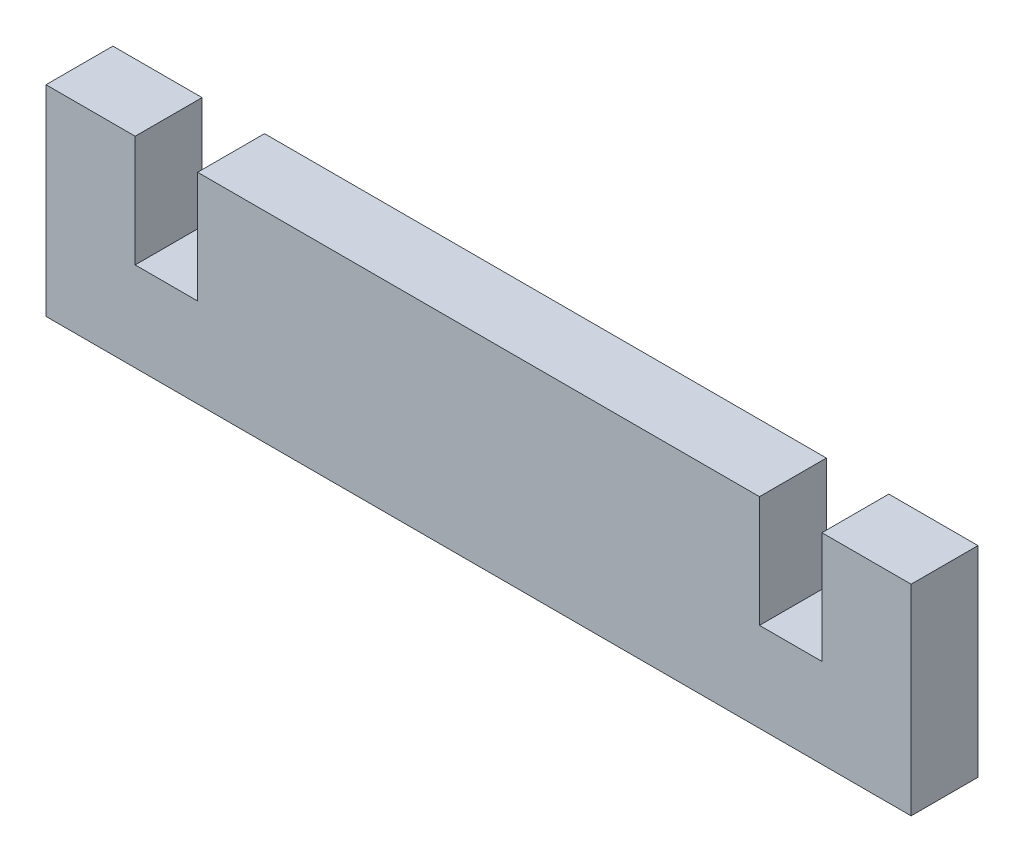
ISO-10303-21;
HEADER;
FILE_DESCRIPTION(('STEP AP214'),'2;1');
FILE_NAME('part.step','',(''),(''),'','','');
FILE_SCHEMA(('AUTOMOTIVE_DESIGN { 1 0 10303 214 1 1 1 1 }'));
ENDSEC;
DATA;
#1=APPLICATION_CONTEXT('core data for automotive mechanical design processes');
#2=APPLICATION_PROTOCOL_DEFINITION('international standard','automotive_design',2000,#1);
#3=PRODUCT_CONTEXT('',#1,'mechanical');
#4=PRODUCT('Part','Part','',(#3));
#5=PRODUCT_RELATED_PRODUCT_CATEGORY('part','',(#4));
#6=PRODUCT_DEFINITION_FORMATION('','',#4);
#7=PRODUCT_DEFINITION_CONTEXT('part definition',#1,'design');
#8=PRODUCT_DEFINITION('design','',#6,#7);
#9=PRODUCT_DEFINITION_SHAPE('','',#8);
#10=(LENGTH_UNIT() NAMED_UNIT(*) SI_UNIT(.MILLI.,.METRE.));
#11=(NAMED_UNIT(*) PLANE_ANGLE_UNIT() SI_UNIT($,.RADIAN.));
#12=(NAMED_UNIT(*) SI_UNIT($,.STERADIAN.) SOLID_ANGLE_UNIT());
#13=UNCERTAINTY_MEASURE_WITH_UNIT(LENGTH_MEASURE(1.E-05),#10,'distance_accuracy_value','');
#14=(GEOMETRIC_REPRESENTATION_CONTEXT(3) GLOBAL_UNCERTAINTY_ASSIGNED_CONTEXT((#13)) GLOBAL_UNIT_ASSIGNED_CONTEXT((#10,
#11,#12)) REPRESENTATION_CONTEXT('',''));
#15=CARTESIAN_POINT('',(0.,0.,0.));
#16=DIRECTION('',(0.,0.,1.));
#17=DIRECTION('',(1.,0.,0.));
#18=AXIS2_PLACEMENT_3D('',#15,#16,#17);
#19=CARTESIAN_POINT('',(77.6,0.,6.));
#20=DIRECTION('',(0.,1.,0.));
#21=DIRECTION('',(0.,0.,1.));
#22=AXIS2_PLACEMENT_3D('',#19,#20,#21);
#23=PLANE('',#22);
#24=DIRECTION('',(1.,0.,0.));
#25=VECTOR('',#24,1.);
#26=CARTESIAN_POINT('',(77.6,0.,0.));
#27=LINE('',#26,#25);
#28=CARTESIAN_POINT('',(0.,0.,0.));
#29=VERTEX_POINT('',#28);
#30=CARTESIAN_POINT('',(77.6,0.,0.));
#31=VERTEX_POINT('',#30);
#32=EDGE_CURVE('E274',#29,#31,#27,.T.);
#33=ORIENTED_EDGE('',*,*,#32,.T.);
#34=DIRECTION('',(0.,0.,-1.));
#35=VECTOR('',#34,1.);
#36=CARTESIAN_POINT('',(77.6,0.,6.));
#37=LINE('',#36,#35);
#38=CARTESIAN_POINT('',(77.6,0.,6.));
#39=VERTEX_POINT('',#38);
#40=EDGE_CURVE('E12',#39,#31,#37,.T.);
#41=ORIENTED_EDGE('',*,*,#40,.F.);
#42=DIRECTION('',(1.,0.,0.));
#43=VECTOR('',#42,1.);
#44=CARTESIAN_POINT('',(77.6,0.,6.));
#45=LINE('',#44,#43);
#46=CARTESIAN_POINT('',(0.,0.,6.));
#47=VERTEX_POINT('',#46);
#48=EDGE_CURVE('E211',#47,#39,#45,.T.);
#49=ORIENTED_EDGE('',*,*,#48,.F.);
#50=DIRECTION('',(0.,0.,-1.));
#51=VECTOR('',#50,1.);
#52=CARTESIAN_POINT('',(0.,0.,6.));
#53=LINE('',#52,#51);
#54=EDGE_CURVE('E169',#47,#29,#53,.T.);
#55=ORIENTED_EDGE('',*,*,#54,.T.);
#56=EDGE_LOOP('',(#33,#41,#49,#55));
#57=FACE_BOUND('',#56,.T.);
#58=ADVANCED_FACE('F46',(#57),#23,.F.);
#59=CARTESIAN_POINT('',(77.6,18.,6.));
#60=DIRECTION('',(-1.,0.,0.));
#61=DIRECTION('',(0.,0.,1.));
#62=AXIS2_PLACEMENT_3D('',#59,#60,#61);
#63=PLANE('',#62);
#64=DIRECTION('',(0.,1.,0.));
#65=VECTOR('',#64,1.);
#66=CARTESIAN_POINT('',(77.6,18.,0.));
#67=LINE('',#66,#65);
#68=CARTESIAN_POINT('',(77.6,18.,0.));
#69=VERTEX_POINT('',#68);
#70=EDGE_CURVE('E265',#31,#69,#67,.T.);
#71=ORIENTED_EDGE('',*,*,#70,.T.);
#72=DIRECTION('',(0.,0.,-1.));
#73=VECTOR('',#72,1.);
#74=CARTESIAN_POINT('',(77.6,18.,6.));
#75=LINE('',#74,#73);
#76=CARTESIAN_POINT('',(77.6,18.,6.));
#77=VERTEX_POINT('',#76);
#78=EDGE_CURVE('E55',#77,#69,#75,.T.);
#79=ORIENTED_EDGE('',*,*,#78,.F.);
#80=DIRECTION('',(0.,1.,0.));
#81=VECTOR('',#80,1.);
#82=CARTESIAN_POINT('',(77.6,18.,6.));
#83=LINE('',#82,#81);
#84=EDGE_CURVE('E118',#39,#77,#83,.T.);
#85=ORIENTED_EDGE('',*,*,#84,.F.);
#86=ORIENTED_EDGE('',*,*,#40,.T.);
#87=EDGE_LOOP('',(#71,#79,#85,#86));
#88=FACE_BOUND('',#87,.T.);
#89=ADVANCED_FACE('F326',(#88),#63,.F.);
#90=CARTESIAN_POINT('',(69.6,18.,6.));
#91=DIRECTION('',(0.,-1.,0.));
#92=DIRECTION('',(1.,0.,0.));
#93=AXIS2_PLACEMENT_3D('',#90,#91,#92);
#94=PLANE('',#93);
#95=DIRECTION('',(-1.,0.,0.));
#96=VECTOR('',#95,1.);
#97=CARTESIAN_POINT('',(69.6,18.,0.));
#98=LINE('',#97,#96);
#99=CARTESIAN_POINT('',(69.6,18.,0.));
#100=VERTEX_POINT('',#99);
#101=EDGE_CURVE('E260',#69,#100,#98,.T.);
#102=ORIENTED_EDGE('',*,*,#101,.T.);
#103=DIRECTION('',(0.,0.,-1.));
#104=VECTOR('',#103,1.);
#105=CARTESIAN_POINT('',(69.6,18.,6.));
#106=LINE('',#105,#104);
#107=CARTESIAN_POINT('',(69.6,18.,6.));
#108=VERTEX_POINT('',#107);
#109=EDGE_CURVE('E250',#108,#100,#106,.T.);
#110=ORIENTED_EDGE('',*,*,#109,.F.);
#111=DIRECTION('',(-1.,0.,0.));
#112=VECTOR('',#111,1.);
#113=CARTESIAN_POINT('',(69.6,18.,6.));
#114=LINE('',#113,#112);
#115=EDGE_CURVE('E204',#77,#108,#114,.T.);
#116=ORIENTED_EDGE('',*,*,#115,.F.);
#117=ORIENTED_EDGE('',*,*,#78,.T.);
#118=EDGE_LOOP('',(#102,#110,#116,#117));
#119=FACE_BOUND('',#118,.T.);
#120=ADVANCED_FACE('F258',(#119),#94,.F.);
#121=CARTESIAN_POINT('',(69.6,7.99999999999999,6.));
#122=DIRECTION('',(1.,0.,0.));
#123=DIRECTION('',(0.,0.,-1.));
#124=AXIS2_PLACEMENT_3D('',#121,#122,#123);
#125=PLANE('',#124);
#126=DIRECTION('',(0.,-1.,0.));
#127=VECTOR('',#126,1.);
#128=CARTESIAN_POINT('',(69.6,7.99999999999999,0.));
#129=LINE('',#128,#127);
#130=CARTESIAN_POINT('',(69.6,7.99999999999999,0.));
#131=VERTEX_POINT('',#130);
#132=EDGE_CURVE('E267',#100,#131,#129,.T.);
#133=ORIENTED_EDGE('',*,*,#132,.T.);
#134=DIRECTION('',(0.,0.,-1.));
#135=VECTOR('',#134,1.);
#136=CARTESIAN_POINT('',(69.6,7.99999999999999,6.));
#137=LINE('',#136,#135);
#138=CARTESIAN_POINT('',(69.6,7.99999999999999,6.));
#139=VERTEX_POINT('',#138);
#140=EDGE_CURVE('E246',#139,#131,#137,.T.);
#141=ORIENTED_EDGE('',*,*,#140,.F.);
#142=DIRECTION('',(0.,-1.,0.));
#143=VECTOR('',#142,1.);
#144=CARTESIAN_POINT('',(69.6,7.99999999999999,6.));
#145=LINE('',#144,#143);
#146=EDGE_CURVE('E200',#108,#139,#145,.T.);
#147=ORIENTED_EDGE('',*,*,#146,.F.);
#148=ORIENTED_EDGE('',*,*,#109,.T.);
#149=EDGE_LOOP('',(#133,#141,#147,#148));
#150=FACE_BOUND('',#149,.T.);
#151=ADVANCED_FACE('F318',(#150),#125,.F.);
#152=CARTESIAN_POINT('',(64.,7.99999999999999,6.));
#153=DIRECTION('',(0.,-1.,0.));
#154=DIRECTION('',(0.,0.,-1.));
#155=AXIS2_PLACEMENT_3D('',#152,#153,#154);
#156=PLANE('',#155);
#157=DIRECTION('',(-1.,0.,0.));
#158=VECTOR('',#157,1.);
#159=CARTESIAN_POINT('',(64.,7.99999999999999,0.));
#160=LINE('',#159,#158);
#161=CARTESIAN_POINT('',(64.,7.99999999999999,0.));
#162=VERTEX_POINT('',#161);
#163=EDGE_CURVE('E272',#131,#162,#160,.T.);
#164=ORIENTED_EDGE('',*,*,#163,.T.);
#165=DIRECTION('',(0.,0.,-1.));
#166=VECTOR('',#165,1.);
#167=CARTESIAN_POINT('',(64.,7.99999999999999,6.));
#168=LINE('',#167,#166);
#169=CARTESIAN_POINT('',(64.,7.99999999999999,6.));
#170=VERTEX_POINT('',#169);
#171=EDGE_CURVE('E242',#170,#162,#168,.T.);
#172=ORIENTED_EDGE('',*,*,#171,.F.);
#173=DIRECTION('',(-1.,0.,0.));
#174=VECTOR('',#173,1.);
#175=CARTESIAN_POINT('',(64.,7.99999999999999,6.));
#176=LINE('',#175,#174);
#177=EDGE_CURVE('E197',#139,#170,#176,.T.);
#178=ORIENTED_EDGE('',*,*,#177,.F.);
#179=ORIENTED_EDGE('',*,*,#140,.T.);
#180=EDGE_LOOP('',(#164,#172,#178,#179));
#181=FACE_BOUND('',#180,.T.);
#182=ADVANCED_FACE('F314',(#181),#156,.F.);
#183=CARTESIAN_POINT('',(64.,18.,6.));
#184=DIRECTION('',(-1.,0.,0.));
#185=DIRECTION('',(0.,0.,1.));
#186=AXIS2_PLACEMENT_3D('',#183,#184,#185);
#187=PLANE('',#186);
#188=DIRECTION('',(0.,1.,0.));
#189=VECTOR('',#188,1.);
#190=CARTESIAN_POINT('',(64.,18.,0.));
#191=LINE('',#190,#189);
#192=CARTESIAN_POINT('',(64.,18.,0.));
#193=VERTEX_POINT('',#192);
#194=EDGE_CURVE('E279',#162,#193,#191,.T.);
#195=ORIENTED_EDGE('',*,*,#194,.T.);
#196=DIRECTION('',(0.,0.,-1.));
#197=VECTOR('',#196,1.);
#198=CARTESIAN_POINT('',(64.,18.,6.));
#199=LINE('',#198,#197);
#200=CARTESIAN_POINT('',(64.,18.,6.));
#201=VERTEX_POINT('',#200);
#202=EDGE_CURVE('E238',#201,#193,#199,.T.);
#203=ORIENTED_EDGE('',*,*,#202,.F.);
#204=DIRECTION('',(0.,1.,0.));
#205=VECTOR('',#204,1.);
#206=CARTESIAN_POINT('',(64.,18.,6.));
#207=LINE('',#206,#205);
#208=EDGE_CURVE('E189',#170,#201,#207,.T.);
#209=ORIENTED_EDGE('',*,*,#208,.F.);
#210=ORIENTED_EDGE('',*,*,#171,.T.);
#211=EDGE_LOOP('',(#195,#203,#209,#210));
#212=FACE_BOUND('',#211,.T.);
#213=ADVANCED_FACE('F309',(#212),#187,.F.);
#214=CARTESIAN_POINT('',(13.6,18.,6.));
#215=DIRECTION('',(0.,-1.,0.));
#216=DIRECTION('',(1.,0.,0.));
#217=AXIS2_PLACEMENT_3D('',#214,#215,#216);
#218=PLANE('',#217);
#219=DIRECTION('',(-1.,0.,0.));
#220=VECTOR('',#219,1.);
#221=CARTESIAN_POINT('',(13.6,18.,0.));
#222=LINE('',#221,#220);
#223=CARTESIAN_POINT('',(13.6,18.,0.));
#224=VERTEX_POINT('',#223);
#225=EDGE_CURVE('E282',#193,#224,#222,.T.);
#226=ORIENTED_EDGE('',*,*,#225,.T.);
#227=DIRECTION('',(0.,0.,-1.));
#228=VECTOR('',#227,1.);
#229=CARTESIAN_POINT('',(13.6,18.,6.));
#230=LINE('',#229,#228);
#231=CARTESIAN_POINT('',(13.6,18.,6.));
#232=VERTEX_POINT('',#231);
#233=EDGE_CURVE('E234',#232,#224,#230,.T.);
#234=ORIENTED_EDGE('',*,*,#233,.F.);
#235=DIRECTION('',(-1.,0.,0.));
#236=VECTOR('',#235,1.);
#237=CARTESIAN_POINT('',(13.6,18.,6.));
#238=LINE('',#237,#236);
#239=EDGE_CURVE('E185',#201,#232,#238,.T.);
#240=ORIENTED_EDGE('',*,*,#239,.F.);
#241=ORIENTED_EDGE('',*,*,#202,.T.);
#242=EDGE_LOOP('',(#226,#234,#240,#241));
#243=FACE_BOUND('',#242,.T.);
#244=ADVANCED_FACE('F305',(#243),#218,.F.);
#245=CARTESIAN_POINT('',(13.6,8.00000000000001,6.));
#246=DIRECTION('',(1.,0.,0.));
#247=DIRECTION('',(0.,0.,-1.));
#248=AXIS2_PLACEMENT_3D('',#245,#246,#247);
#249=PLANE('',#248);
#250=DIRECTION('',(0.,-1.,0.));
#251=VECTOR('',#250,1.);
#252=CARTESIAN_POINT('',(13.6,8.00000000000001,0.));
#253=LINE('',#252,#251);
#254=CARTESIAN_POINT('',(13.6,8.00000000000001,0.));
#255=VERTEX_POINT('',#254);
#256=EDGE_CURVE('E285',#224,#255,#253,.T.);
#257=ORIENTED_EDGE('',*,*,#256,.T.);
#258=DIRECTION('',(0.,0.,-1.));
#259=VECTOR('',#258,1.);
#260=CARTESIAN_POINT('',(13.6,8.00000000000001,6.));
#261=LINE('',#260,#259);
#262=CARTESIAN_POINT('',(13.6,8.00000000000001,6.));
#263=VERTEX_POINT('',#262);
#264=EDGE_CURVE('E231',#263,#255,#261,.T.);
#265=ORIENTED_EDGE('',*,*,#264,.F.);
#266=DIRECTION('',(0.,-1.,0.));
#267=VECTOR('',#266,1.);
#268=CARTESIAN_POINT('',(13.6,8.00000000000001,6.));
#269=LINE('',#268,#267);
#270=EDGE_CURVE('E182',#232,#263,#269,.T.);
#271=ORIENTED_EDGE('',*,*,#270,.F.);
#272=ORIENTED_EDGE('',*,*,#233,.T.);
#273=EDGE_LOOP('',(#257,#265,#271,#272));
#274=FACE_BOUND('',#273,.T.);
#275=ADVANCED_FACE('F301',(#274),#249,.F.);
#276=CARTESIAN_POINT('',(8.,8.00000000000001,6.));
#277=DIRECTION('',(0.,-1.,0.));
#278=DIRECTION('',(0.,0.,-1.));
#279=AXIS2_PLACEMENT_3D('',#276,#277,#278);
#280=PLANE('',#279);
#281=DIRECTION('',(-1.,0.,0.));
#282=VECTOR('',#281,1.);
#283=CARTESIAN_POINT('',(8.,8.00000000000001,0.));
#284=LINE('',#283,#282);
#285=CARTESIAN_POINT('',(8.,8.00000000000001,0.));
#286=VERTEX_POINT('',#285);
#287=EDGE_CURVE('E288',#255,#286,#284,.T.);
#288=ORIENTED_EDGE('',*,*,#287,.T.);
#289=DIRECTION('',(0.,0.,-1.));
#290=VECTOR('',#289,1.);
#291=CARTESIAN_POINT('',(8.,8.00000000000001,6.));
#292=LINE('',#291,#290);
#293=CARTESIAN_POINT('',(8.,8.00000000000001,6.));
#294=VERTEX_POINT('',#293);
#295=EDGE_CURVE('E160',#294,#286,#292,.T.);
#296=ORIENTED_EDGE('',*,*,#295,.F.);
#297=DIRECTION('',(-1.,0.,0.));
#298=VECTOR('',#297,1.);
#299=CARTESIAN_POINT('',(8.,8.00000000000001,6.));
#300=LINE('',#299,#298);
#301=EDGE_CURVE('E149',#263,#294,#300,.T.);
#302=ORIENTED_EDGE('',*,*,#301,.F.);
#303=ORIENTED_EDGE('',*,*,#264,.T.);
#304=EDGE_LOOP('',(#288,#296,#302,#303));
#305=FACE_BOUND('',#304,.T.);
#306=ADVANCED_FACE('F297',(#305),#280,.F.);
#307=CARTESIAN_POINT('',(8.,18.,6.));
#308=DIRECTION('',(-1.,0.,0.));
#309=DIRECTION('',(0.,-1.,0.));
#310=AXIS2_PLACEMENT_3D('',#307,#308,#309);
#311=PLANE('',#310);
#312=DIRECTION('',(0.,1.,0.));
#313=VECTOR('',#312,1.);
#314=CARTESIAN_POINT('',(8.,18.,0.));
#315=LINE('',#314,#313);
#316=CARTESIAN_POINT('',(8.,18.,0.));
#317=VERTEX_POINT('',#316);
#318=EDGE_CURVE('E158',#286,#317,#315,.T.);
#319=ORIENTED_EDGE('',*,*,#318,.T.);
#320=DIRECTION('',(0.,0.,-1.));
#321=VECTOR('',#320,1.);
#322=CARTESIAN_POINT('',(8.,18.,6.));
#323=LINE('',#322,#321);
#324=CARTESIAN_POINT('',(8.,18.,6.));
#325=VERTEX_POINT('',#324);
#326=EDGE_CURVE('E155',#325,#317,#323,.T.);
#327=ORIENTED_EDGE('',*,*,#326,.F.);
#328=DIRECTION('',(0.,1.,0.));
#329=VECTOR('',#328,1.);
#330=CARTESIAN_POINT('',(8.,18.,6.));
#331=LINE('',#330,#329);
#332=EDGE_CURVE('E143',#294,#325,#331,.T.);
#333=ORIENTED_EDGE('',*,*,#332,.F.);
#334=ORIENTED_EDGE('',*,*,#295,.T.);
#335=EDGE_LOOP('',(#319,#327,#333,#334));
#336=FACE_BOUND('',#335,.T.);
#337=ADVANCED_FACE('F156',(#336),#311,.F.);
#338=CARTESIAN_POINT('',(0.,18.,6.));
#339=DIRECTION('',(0.,-1.,0.));
#340=DIRECTION('',(1.,0.,0.));
#341=AXIS2_PLACEMENT_3D('',#338,#339,#340);
#342=PLANE('',#341);
#343=DIRECTION('',(-1.,0.,0.));
#344=VECTOR('',#343,1.);
#345=CARTESIAN_POINT('',(0.,18.,0.));
#346=LINE('',#345,#344);
#347=CARTESIAN_POINT('',(0.,18.,0.));
#348=VERTEX_POINT('',#347);
#349=EDGE_CURVE('E104',#317,#348,#346,.T.);
#350=ORIENTED_EDGE('',*,*,#349,.T.);
#351=DIRECTION('',(0.,0.,-1.));
#352=VECTOR('',#351,1.);
#353=CARTESIAN_POINT('',(0.,18.,6.));
#354=LINE('',#353,#352);
#355=CARTESIAN_POINT('',(0.,18.,6.));
#356=VERTEX_POINT('',#355);
#357=EDGE_CURVE('E161',#356,#348,#354,.T.);
#358=ORIENTED_EDGE('',*,*,#357,.F.);
#359=DIRECTION('',(-1.,0.,0.));
#360=VECTOR('',#359,1.);
#361=CARTESIAN_POINT('',(0.,18.,6.));
#362=LINE('',#361,#360);
#363=EDGE_CURVE('E147',#325,#356,#362,.T.);
#364=ORIENTED_EDGE('',*,*,#363,.F.);
#365=ORIENTED_EDGE('',*,*,#326,.T.);
#366=EDGE_LOOP('',(#350,#358,#364,#365));
#367=FACE_BOUND('',#366,.T.);
#368=ADVANCED_FACE('F163',(#367),#342,.F.);
#369=CARTESIAN_POINT('',(0.,0.,6.));
#370=DIRECTION('',(1.,0.,0.));
#371=DIRECTION('',(0.,0.,-1.));
#372=AXIS2_PLACEMENT_3D('',#369,#370,#371);
#373=PLANE('',#372);
#374=DIRECTION('',(0.,-1.,0.));
#375=VECTOR('',#374,1.);
#376=CARTESIAN_POINT('',(0.,0.,0.));
#377=LINE('',#376,#375);
#378=EDGE_CURVE('E110',#348,#29,#377,.T.);
#379=ORIENTED_EDGE('',*,*,#378,.T.);
#380=ORIENTED_EDGE('',*,*,#54,.F.);
#381=DIRECTION('',(0.,-1.,0.));
#382=VECTOR('',#381,1.);
#383=CARTESIAN_POINT('',(0.,0.,6.));
#384=LINE('',#383,#382);
#385=EDGE_CURVE('E63',#356,#47,#384,.T.);
#386=ORIENTED_EDGE('',*,*,#385,.F.);
#387=ORIENTED_EDGE('',*,*,#357,.T.);
#388=EDGE_LOOP('',(#379,#380,#386,#387));
#389=FACE_BOUND('',#388,.T.);
#390=ADVANCED_FACE('F396',(#389),#373,.F.);
#391=CARTESIAN_POINT('',(0.,0.,6.));
#392=DIRECTION('',(0.,0.,-1.));
#393=DIRECTION('',(-1.,0.,0.));
#394=AXIS2_PLACEMENT_3D('',#391,#392,#393);
#395=PLANE('',#394);
#396=ORIENTED_EDGE('',*,*,#48,.T.);
#397=ORIENTED_EDGE('',*,*,#84,.T.);
#398=ORIENTED_EDGE('',*,*,#115,.T.);
#399=ORIENTED_EDGE('',*,*,#146,.T.);
#400=ORIENTED_EDGE('',*,*,#177,.T.);
#401=ORIENTED_EDGE('',*,*,#208,.T.);
#402=ORIENTED_EDGE('',*,*,#239,.T.);
#403=ORIENTED_EDGE('',*,*,#270,.T.);
#404=ORIENTED_EDGE('',*,*,#301,.T.);
#405=ORIENTED_EDGE('',*,*,#332,.T.);
#406=ORIENTED_EDGE('',*,*,#363,.T.);
#407=ORIENTED_EDGE('',*,*,#385,.T.);
#408=EDGE_LOOP('',(#396,#397,#398,#399,#400,#401,#402,#403,#404,#405,#406,#407));
#409=FACE_BOUND('',#408,.T.);
#410=ADVANCED_FACE('F145',(#409),#395,.F.);
#411=CARTESIAN_POINT('',(0.,0.,0.));
#412=DIRECTION('',(0.,0.,-1.));
#413=DIRECTION('',(-1.,0.,0.));
#414=AXIS2_PLACEMENT_3D('',#411,#412,#413);
#415=PLANE('',#414);
#416=ORIENTED_EDGE('',*,*,#32,.F.);
#417=ORIENTED_EDGE('',*,*,#378,.F.);
#418=ORIENTED_EDGE('',*,*,#349,.F.);
#419=ORIENTED_EDGE('',*,*,#318,.F.);
#420=ORIENTED_EDGE('',*,*,#287,.F.);
#421=ORIENTED_EDGE('',*,*,#256,.F.);
#422=ORIENTED_EDGE('',*,*,#225,.F.);
#423=ORIENTED_EDGE('',*,*,#194,.F.);
#424=ORIENTED_EDGE('',*,*,#163,.F.);
#425=ORIENTED_EDGE('',*,*,#132,.F.);
#426=ORIENTED_EDGE('',*,*,#101,.F.);
#427=ORIENTED_EDGE('',*,*,#70,.F.);
#428=EDGE_LOOP('',(#416,#417,#418,#419,#420,#421,#422,#423,#424,#425,#426,#427));
#429=FACE_BOUND('',#428,.T.);
#430=ADVANCED_FACE('F264',(#429),#415,.T.);
#431=CLOSED_SHELL('',(#58,#89,#120,#151,#182,#213,#244,#275,#306,#337,#368,#390,#410,#430));
#432=MANIFOLD_SOLID_BREP('B2',#431);
#433=ADVANCED_BREP_SHAPE_REPRESENTATION('',(#18,#432),#14);
#434=SHAPE_DEFINITION_REPRESENTATION(#9,#433);
ENDSEC;
END-ISO-10303-21;
